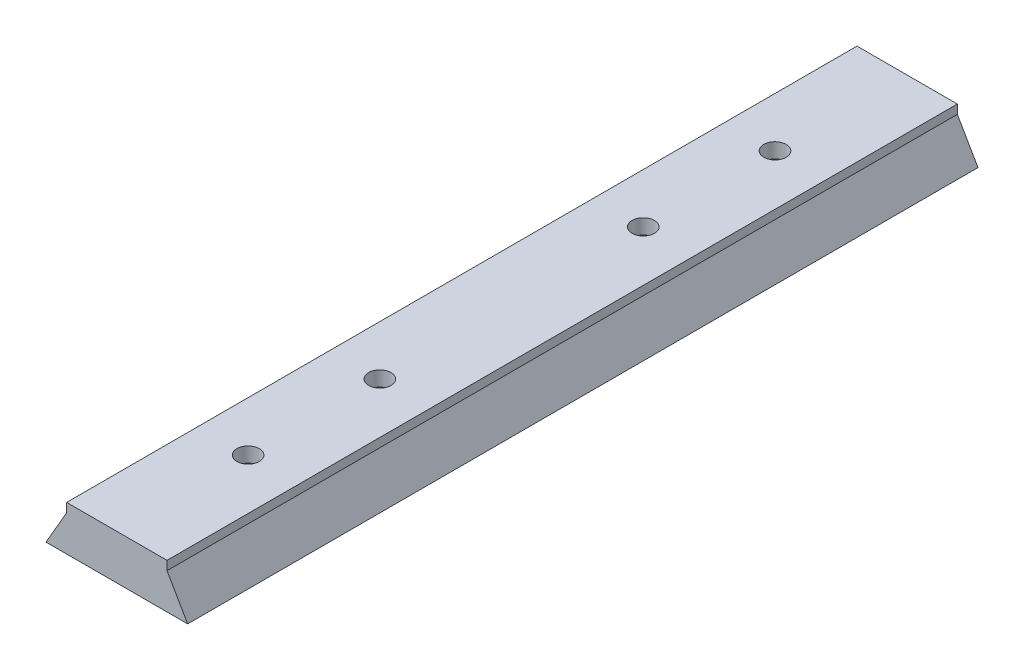
ISO-10303-21;
HEADER;
FILE_DESCRIPTION(('STEP AP214'),'2;1');
FILE_NAME('part.step','',(''),(''),'','','');
FILE_SCHEMA(('AUTOMOTIVE_DESIGN { 1 0 10303 214 1 1 1 1 }'));
ENDSEC;
DATA;
#1=APPLICATION_CONTEXT('core data for automotive mechanical design processes');
#2=APPLICATION_PROTOCOL_DEFINITION('international standard','automotive_design',2000,#1);
#3=PRODUCT_CONTEXT('',#1,'mechanical');
#4=PRODUCT('Part','Part','',(#3));
#5=PRODUCT_RELATED_PRODUCT_CATEGORY('part','',(#4));
#6=PRODUCT_DEFINITION_FORMATION('','',#4);
#7=PRODUCT_DEFINITION_CONTEXT('part definition',#1,'design');
#8=PRODUCT_DEFINITION('design','',#6,#7);
#9=PRODUCT_DEFINITION_SHAPE('','',#8);
#10=(LENGTH_UNIT() NAMED_UNIT(*) SI_UNIT(.MILLI.,.METRE.));
#11=(NAMED_UNIT(*) PLANE_ANGLE_UNIT() SI_UNIT($,.RADIAN.));
#12=(NAMED_UNIT(*) SI_UNIT($,.STERADIAN.) SOLID_ANGLE_UNIT());
#13=UNCERTAINTY_MEASURE_WITH_UNIT(LENGTH_MEASURE(1.E-05),#10,'distance_accuracy_value','');
#14=(GEOMETRIC_REPRESENTATION_CONTEXT(3) GLOBAL_UNCERTAINTY_ASSIGNED_CONTEXT((#13)) GLOBAL_UNIT_ASSIGNED_CONTEXT((#10,
#11,#12)) REPRESENTATION_CONTEXT('',''));
#15=CARTESIAN_POINT('',(0.,0.,0.));
#16=DIRECTION('',(0.,0.,1.));
#17=DIRECTION('',(1.,0.,0.));
#18=AXIS2_PLACEMENT_3D('',#15,#16,#17);
#19=CARTESIAN_POINT('',(170.94,-6.99999999999998,35.3333333333333));
#20=DIRECTION('',(0.,1.,0.));
#21=DIRECTION('',(-1.,0.,0.));
#22=AXIS2_PLACEMENT_3D('',#19,#20,#21);
#23=CYLINDRICAL_SURFACE('',#22,1.5);
#24=CARTESIAN_POINT('',(170.94,0.,35.3333333333333));
#25=DIRECTION('',(0.,-1.,0.));
#26=DIRECTION('',(0.,0.,-1.));
#27=AXIS2_PLACEMENT_3D('',#24,#25,#26);
#28=CIRCLE('',#27,1.5);
#29=CARTESIAN_POINT('',(170.94,0.,33.8333333333333));
#30=VERTEX_POINT('',#29);
#31=EDGE_CURVE('E106',#30,#30,#28,.F.);
#32=ORIENTED_EDGE('',*,*,#31,.T.);
#33=EDGE_LOOP('',(#32));
#34=FACE_BOUND('',#33,.T.);
#35=CARTESIAN_POINT('',(170.94,-1.99999999999999,35.3333333333333));
#36=DIRECTION('',(0.,-1.,0.));
#37=DIRECTION('',(1.,0.,0.));
#38=AXIS2_PLACEMENT_3D('',#35,#36,#37);
#39=CIRCLE('',#38,1.5);
#40=CARTESIAN_POINT('',(172.44,-1.99999999999999,35.3333333333333));
#41=VERTEX_POINT('',#40);
#42=EDGE_CURVE('E157',#41,#41,#39,.F.);
#43=ORIENTED_EDGE('',*,*,#42,.F.);
#44=EDGE_LOOP('',(#43));
#45=FACE_BOUND('',#44,.T.);
#46=ADVANCED_FACE('F35',(#34,#45),#23,.F.);
#47=CARTESIAN_POINT('',(170.94,-6.99999999999998,17.6666666666667));
#48=DIRECTION('',(0.,1.,0.));
#49=DIRECTION('',(-1.,0.,0.));
#50=AXIS2_PLACEMENT_3D('',#47,#48,#49);
#51=CYLINDRICAL_SURFACE('',#50,1.5);
#52=CARTESIAN_POINT('',(170.94,0.,17.6666666666667));
#53=DIRECTION('',(0.,-1.,0.));
#54=DIRECTION('',(0.,0.,-1.));
#55=AXIS2_PLACEMENT_3D('',#52,#53,#54);
#56=CIRCLE('',#55,1.5);
#57=CARTESIAN_POINT('',(170.94,0.,16.1666666666667));
#58=VERTEX_POINT('',#57);
#59=EDGE_CURVE('E150',#58,#58,#56,.F.);
#60=ORIENTED_EDGE('',*,*,#59,.T.);
#61=EDGE_LOOP('',(#60));
#62=FACE_BOUND('',#61,.T.);
#63=CARTESIAN_POINT('',(170.94,-1.99999999999999,17.6666666666667));
#64=DIRECTION('',(0.,-1.,0.));
#65=DIRECTION('',(1.,0.,0.));
#66=AXIS2_PLACEMENT_3D('',#63,#64,#65);
#67=CIRCLE('',#66,1.5);
#68=CARTESIAN_POINT('',(172.44,-1.99999999999999,17.6666666666667));
#69=VERTEX_POINT('',#68);
#70=EDGE_CURVE('E154',#69,#69,#67,.F.);
#71=ORIENTED_EDGE('',*,*,#70,.F.);
#72=EDGE_LOOP('',(#71));
#73=FACE_BOUND('',#72,.T.);
#74=ADVANCED_FACE('F180',(#62,#73),#51,.F.);
#75=CARTESIAN_POINT('',(0.,0.,0.));
#76=DIRECTION('',(0.,-1.,0.));
#77=DIRECTION('',(0.,0.,-1.));
#78=AXIS2_PLACEMENT_3D('',#75,#76,#77);
#79=PLANE('',#78);
#80=ORIENTED_EDGE('',*,*,#31,.F.);
#81=EDGE_LOOP('',(#80));
#82=FACE_BOUND('',#81,.T.);
#83=CARTESIAN_POINT('',(170.94,0.,88.3333333333333));
#84=DIRECTION('',(0.,-1.,0.));
#85=DIRECTION('',(0.,0.,-1.));
#86=AXIS2_PLACEMENT_3D('',#83,#84,#85);
#87=CIRCLE('',#86,1.5);
#88=CARTESIAN_POINT('',(170.94,0.,86.8333333333333));
#89=VERTEX_POINT('',#88);
#90=EDGE_CURVE('E100',#89,#89,#87,.T.);
#91=ORIENTED_EDGE('',*,*,#90,.T.);
#92=EDGE_LOOP('',(#91));
#93=FACE_BOUND('',#92,.T.);
#94=CARTESIAN_POINT('',(170.94,0.,70.6666666666667));
#95=DIRECTION('',(0.,-1.,0.));
#96=DIRECTION('',(0.,0.,-1.));
#97=AXIS2_PLACEMENT_3D('',#94,#95,#96);
#98=CIRCLE('',#97,1.5);
#99=CARTESIAN_POINT('',(170.94,0.,69.1666666666667));
#100=VERTEX_POINT('',#99);
#101=EDGE_CURVE('E44',#100,#100,#98,.T.);
#102=ORIENTED_EDGE('',*,*,#101,.T.);
#103=EDGE_LOOP('',(#102));
#104=FACE_BOUND('',#103,.T.);
#105=ORIENTED_EDGE('',*,*,#59,.F.);
#106=EDGE_LOOP('',(#105));
#107=FACE_BOUND('',#106,.T.);
#108=DIRECTION('',(0.,0.,-1.));
#109=VECTOR('',#108,1.);
#110=CARTESIAN_POINT('',(164.27128129211,0.,106.));
#111=LINE('',#110,#109);
#112=CARTESIAN_POINT('',(164.27128129211,0.,106.));
#113=VERTEX_POINT('',#112);
#114=CARTESIAN_POINT('',(164.27128129211,0.,0.));
#115=VERTEX_POINT('',#114);
#116=EDGE_CURVE('E103',#113,#115,#111,.T.);
#117=ORIENTED_EDGE('',*,*,#116,.F.);
#118=DIRECTION('',(1.,0.,0.));
#119=VECTOR('',#118,1.);
#120=CARTESIAN_POINT('',(0.,0.,106.));
#121=LINE('',#120,#119);
#122=CARTESIAN_POINT('',(177.72871870789,0.,106.));
#123=VERTEX_POINT('',#122);
#124=EDGE_CURVE('E90',#113,#123,#121,.T.);
#125=ORIENTED_EDGE('',*,*,#124,.T.);
#126=DIRECTION('',(0.,0.,-1.));
#127=VECTOR('',#126,1.);
#128=CARTESIAN_POINT('',(177.72871870789,0.,106.));
#129=LINE('',#128,#127);
#130=CARTESIAN_POINT('',(177.72871870789,0.,0.));
#131=VERTEX_POINT('',#130);
#132=EDGE_CURVE('E11',#123,#131,#129,.T.);
#133=ORIENTED_EDGE('',*,*,#132,.T.);
#134=DIRECTION('',(1.,0.,0.));
#135=VECTOR('',#134,1.);
#136=CARTESIAN_POINT('',(0.,0.,0.));
#137=LINE('',#136,#135);
#138=EDGE_CURVE('E52',#115,#131,#137,.T.);
#139=ORIENTED_EDGE('',*,*,#138,.F.);
#140=EDGE_LOOP('',(#117,#125,#133,#139));
#141=FACE_BOUND('',#140,.T.);
#142=ADVANCED_FACE('F37',(#82,#93,#104,#107,#141),#79,.F.);
#143=CARTESIAN_POINT('',(0.,-6.00000000000003,106.));
#144=DIRECTION('',(0.,-1.,0.));
#145=DIRECTION('',(1.,0.,0.));
#146=AXIS2_PLACEMENT_3D('',#143,#144,#145);
#147=PLANE('',#146);
#148=CARTESIAN_POINT('',(170.94,-5.99999999999999,88.3333333333333));
#149=DIRECTION('',(0.,-1.,0.));
#150=DIRECTION('',(-1.,0.,0.));
#151=AXIS2_PLACEMENT_3D('',#148,#149,#150);
#152=CIRCLE('',#151,2.99999999999999);
#153=CARTESIAN_POINT('',(167.94,-5.99999999999999,88.3333333333333));
#154=VERTEX_POINT('',#153);
#155=EDGE_CURVE('E373',#154,#154,#152,.T.);
#156=ORIENTED_EDGE('',*,*,#155,.F.);
#157=EDGE_LOOP('',(#156));
#158=FACE_BOUND('',#157,.T.);
#159=CARTESIAN_POINT('',(170.94,-5.99999999999999,70.6666666666667));
#160=DIRECTION('',(0.,-1.,0.));
#161=DIRECTION('',(-1.,0.,0.));
#162=AXIS2_PLACEMENT_3D('',#159,#160,#161);
#163=CIRCLE('',#162,2.99999999999999);
#164=CARTESIAN_POINT('',(167.94,-5.99999999999999,70.6666666666667));
#165=VERTEX_POINT('',#164);
#166=EDGE_CURVE('E366',#165,#165,#163,.T.);
#167=ORIENTED_EDGE('',*,*,#166,.F.);
#168=EDGE_LOOP('',(#167));
#169=FACE_BOUND('',#168,.T.);
#170=CARTESIAN_POINT('',(170.94,-5.99999999999999,17.6666666666667));
#171=DIRECTION('',(0.,-1.,0.));
#172=DIRECTION('',(1.,0.,0.));
#173=AXIS2_PLACEMENT_3D('',#170,#171,#172);
#174=CIRCLE('',#173,2.99999999999999);
#175=CARTESIAN_POINT('',(173.94,-5.99999999999999,17.6666666666667));
#176=VERTEX_POINT('',#175);
#177=EDGE_CURVE('E370',#176,#176,#174,.T.);
#178=ORIENTED_EDGE('',*,*,#177,.F.);
#179=EDGE_LOOP('',(#178));
#180=FACE_BOUND('',#179,.T.);
#181=CARTESIAN_POINT('',(170.94,-5.99999999999999,35.3333333333333));
#182=DIRECTION('',(0.,-1.,0.));
#183=DIRECTION('',(1.,0.,0.));
#184=AXIS2_PLACEMENT_3D('',#181,#182,#183);
#185=CIRCLE('',#184,2.99999999999999);
#186=CARTESIAN_POINT('',(173.94,-5.99999999999999,35.3333333333333));
#187=VERTEX_POINT('',#186);
#188=EDGE_CURVE('E118',#187,#187,#185,.T.);
#189=ORIENTED_EDGE('',*,*,#188,.F.);
#190=EDGE_LOOP('',(#189));
#191=FACE_BOUND('',#190,.T.);
#192=DIRECTION('',(-1.,0.,0.));
#193=VECTOR('',#192,1.);
#194=CARTESIAN_POINT('',(0.,-6.00000000000003,0.));
#195=LINE('',#194,#193);
#196=CARTESIAN_POINT('',(180.5,-5.99999999999998,0.));
#197=VERTEX_POINT('',#196);
#198=CARTESIAN_POINT('',(161.5,-6.00000000000001,0.));
#199=VERTEX_POINT('',#198);
#200=EDGE_CURVE('E133',#197,#199,#195,.T.);
#201=ORIENTED_EDGE('',*,*,#200,.F.);
#202=DIRECTION('',(0.,0.,-1.));
#203=VECTOR('',#202,1.);
#204=CARTESIAN_POINT('',(180.5,-5.99999999999998,106.));
#205=LINE('',#204,#203);
#206=CARTESIAN_POINT('',(180.5,-5.99999999999998,106.));
#207=VERTEX_POINT('',#206);
#208=EDGE_CURVE('E139',#207,#197,#205,.T.);
#209=ORIENTED_EDGE('',*,*,#208,.F.);
#210=DIRECTION('',(-1.,0.,0.));
#211=VECTOR('',#210,1.);
#212=CARTESIAN_POINT('',(0.,-6.00000000000003,106.));
#213=LINE('',#212,#211);
#214=CARTESIAN_POINT('',(161.5,-6.00000000000001,106.));
#215=VERTEX_POINT('',#214);
#216=EDGE_CURVE('E113',#207,#215,#213,.T.);
#217=ORIENTED_EDGE('',*,*,#216,.T.);
#218=DIRECTION('',(0.,0.,-1.));
#219=VECTOR('',#218,1.);
#220=CARTESIAN_POINT('',(161.5,-6.00000000000001,106.));
#221=LINE('',#220,#219);
#222=EDGE_CURVE('E141',#215,#199,#221,.T.);
#223=ORIENTED_EDGE('',*,*,#222,.T.);
#224=EDGE_LOOP('',(#201,#209,#217,#223));
#225=FACE_BOUND('',#224,.T.);
#226=ADVANCED_FACE('F174',(#158,#169,#180,#191,#225),#147,.T.);
#227=CARTESIAN_POINT('',(170.94,-6.99999999999998,70.6666666666667));
#228=DIRECTION('',(0.,1.,0.));
#229=DIRECTION('',(-1.,0.,0.));
#230=AXIS2_PLACEMENT_3D('',#227,#228,#229);
#231=CYLINDRICAL_SURFACE('',#230,1.5);
#232=CARTESIAN_POINT('',(170.94,-1.99999999999999,70.6666666666667));
#233=DIRECTION('',(0.,1.,0.));
#234=DIRECTION('',(-1.,0.,0.));
#235=AXIS2_PLACEMENT_3D('',#232,#233,#234);
#236=CIRCLE('',#235,1.5);
#237=CARTESIAN_POINT('',(169.44,-1.99999999999999,70.6666666666667));
#238=VERTEX_POINT('',#237);
#239=EDGE_CURVE('E39',#238,#238,#236,.T.);
#240=ORIENTED_EDGE('',*,*,#239,.F.);
#241=EDGE_LOOP('',(#240));
#242=FACE_BOUND('',#241,.T.);
#243=ORIENTED_EDGE('',*,*,#101,.F.);
#244=EDGE_LOOP('',(#243));
#245=FACE_BOUND('',#244,.T.);
#246=ADVANCED_FACE('F170',(#242,#245),#231,.F.);
#247=CARTESIAN_POINT('',(170.94,-6.99999999999998,88.3333333333333));
#248=DIRECTION('',(0.,1.,0.));
#249=DIRECTION('',(-1.,0.,0.));
#250=AXIS2_PLACEMENT_3D('',#247,#248,#249);
#251=CYLINDRICAL_SURFACE('',#250,1.5);
#252=CARTESIAN_POINT('',(170.94,-1.99999999999999,88.3333333333333));
#253=DIRECTION('',(0.,1.,0.));
#254=DIRECTION('',(-1.,0.,0.));
#255=AXIS2_PLACEMENT_3D('',#252,#253,#254);
#256=CIRCLE('',#255,1.5);
#257=CARTESIAN_POINT('',(169.44,-1.99999999999999,88.3333333333333));
#258=VERTEX_POINT('',#257);
#259=EDGE_CURVE('E160',#258,#258,#256,.T.);
#260=ORIENTED_EDGE('',*,*,#259,.F.);
#261=EDGE_LOOP('',(#260));
#262=FACE_BOUND('',#261,.T.);
#263=ORIENTED_EDGE('',*,*,#90,.F.);
#264=EDGE_LOOP('',(#263));
#265=FACE_BOUND('',#264,.T.);
#266=ADVANCED_FACE('F173',(#262,#265),#251,.F.);
#267=CARTESIAN_POINT('',(123.723076211353,-71.4315513555935,106.));
#268=DIRECTION('',(-0.866025403784438,0.500000000000001,0.));
#269=DIRECTION('',(-0.500000000000001,-0.866025403784438,0.));
#270=AXIS2_PLACEMENT_3D('',#267,#268,#269);
#271=PLANE('',#270);
#272=DIRECTION('',(0.500000000000001,0.866025403784438,0.));
#273=VECTOR('',#272,1.);
#274=CARTESIAN_POINT('',(123.723076211353,-71.4315513555935,0.));
#275=LINE('',#274,#273);
#276=CARTESIAN_POINT('',(164.27128129211,-1.19999999999999,0.));
#277=VERTEX_POINT('',#276);
#278=EDGE_CURVE('E130',#199,#277,#275,.T.);
#279=ORIENTED_EDGE('',*,*,#278,.F.);
#280=ORIENTED_EDGE('',*,*,#222,.F.);
#281=DIRECTION('',(0.500000000000001,0.866025403784438,0.));
#282=VECTOR('',#281,1.);
#283=CARTESIAN_POINT('',(123.723076211353,-71.4315513555935,106.));
#284=LINE('',#283,#282);
#285=CARTESIAN_POINT('',(164.27128129211,-1.19999999999999,106.));
#286=VERTEX_POINT('',#285);
#287=EDGE_CURVE('E110',#215,#286,#284,.T.);
#288=ORIENTED_EDGE('',*,*,#287,.T.);
#289=DIRECTION('',(0.,0.,-1.));
#290=VECTOR('',#289,1.);
#291=CARTESIAN_POINT('',(164.27128129211,-1.19999999999999,106.));
#292=LINE('',#291,#290);
#293=EDGE_CURVE('E107',#286,#277,#292,.T.);
#294=ORIENTED_EDGE('',*,*,#293,.T.);
#295=EDGE_LOOP('',(#279,#280,#288,#294));
#296=FACE_BOUND('',#295,.T.);
#297=ADVANCED_FACE('F215',(#296),#271,.T.);
#298=CARTESIAN_POINT('',(132.776923788647,76.6587926915457,106.));
#299=DIRECTION('',(0.866025403784438,0.500000000000001,0.));
#300=DIRECTION('',(-0.500000000000001,0.866025403784438,0.));
#301=AXIS2_PLACEMENT_3D('',#298,#299,#300);
#302=PLANE('',#301);
#303=DIRECTION('',(0.500000000000001,-0.866025403784438,0.));
#304=VECTOR('',#303,1.);
#305=CARTESIAN_POINT('',(132.776923788647,76.6587926915457,0.));
#306=LINE('',#305,#304);
#307=CARTESIAN_POINT('',(177.72871870789,-1.19999999999998,0.));
#308=VERTEX_POINT('',#307);
#309=EDGE_CURVE('E115',#308,#197,#306,.T.);
#310=ORIENTED_EDGE('',*,*,#309,.F.);
#311=DIRECTION('',(0.,0.,-1.));
#312=VECTOR('',#311,1.);
#313=CARTESIAN_POINT('',(177.72871870789,-1.19999999999998,106.));
#314=LINE('',#313,#312);
#315=CARTESIAN_POINT('',(177.72871870789,-1.19999999999998,106.));
#316=VERTEX_POINT('',#315);
#317=EDGE_CURVE('E127',#316,#308,#314,.T.);
#318=ORIENTED_EDGE('',*,*,#317,.F.);
#319=DIRECTION('',(0.500000000000001,-0.866025403784438,0.));
#320=VECTOR('',#319,1.);
#321=CARTESIAN_POINT('',(132.776923788647,76.6587926915457,106.));
#322=LINE('',#321,#320);
#323=EDGE_CURVE('E123',#316,#207,#322,.T.);
#324=ORIENTED_EDGE('',*,*,#323,.T.);
#325=ORIENTED_EDGE('',*,*,#208,.T.);
#326=EDGE_LOOP('',(#310,#318,#324,#325));
#327=FACE_BOUND('',#326,.T.);
#328=ADVANCED_FACE('F221',(#327),#302,.T.);
#329=CARTESIAN_POINT('',(0.,0.,106.));
#330=DIRECTION('',(0.,0.,1.));
#331=DIRECTION('',(1.,0.,0.));
#332=AXIS2_PLACEMENT_3D('',#329,#330,#331);
#333=PLANE('',#332);
#334=ORIENTED_EDGE('',*,*,#124,.F.);
#335=DIRECTION('',(0.,1.,0.));
#336=VECTOR('',#335,1.);
#337=CARTESIAN_POINT('',(164.27128129211,-7.59907328229902E-12,106.));
#338=LINE('',#337,#336);
#339=EDGE_CURVE('E95',#286,#113,#338,.T.);
#340=ORIENTED_EDGE('',*,*,#339,.F.);
#341=ORIENTED_EDGE('',*,*,#287,.F.);
#342=ORIENTED_EDGE('',*,*,#216,.F.);
#343=ORIENTED_EDGE('',*,*,#323,.F.);
#344=DIRECTION('',(0.,-1.,0.));
#345=VECTOR('',#344,1.);
#346=CARTESIAN_POINT('',(177.72871870789,0.,106.));
#347=LINE('',#346,#345);
#348=EDGE_CURVE('E98',#123,#316,#347,.T.);
#349=ORIENTED_EDGE('',*,*,#348,.F.);
#350=EDGE_LOOP('',(#334,#340,#341,#342,#343,#349));
#351=FACE_BOUND('',#350,.T.);
#352=ADVANCED_FACE('F92',(#351),#333,.T.);
#353=CARTESIAN_POINT('',(0.,0.,0.));
#354=DIRECTION('',(0.,0.,1.));
#355=DIRECTION('',(1.,0.,0.));
#356=AXIS2_PLACEMENT_3D('',#353,#354,#355);
#357=PLANE('',#356);
#358=DIRECTION('',(0.,1.,0.));
#359=VECTOR('',#358,1.);
#360=CARTESIAN_POINT('',(164.27128129211,-7.59907328229902E-12,0.));
#361=LINE('',#360,#359);
#362=EDGE_CURVE('E128',#277,#115,#361,.T.);
#363=ORIENTED_EDGE('',*,*,#362,.T.);
#364=ORIENTED_EDGE('',*,*,#138,.T.);
#365=DIRECTION('',(0.,-1.,0.));
#366=VECTOR('',#365,1.);
#367=CARTESIAN_POINT('',(177.72871870789,0.,0.));
#368=LINE('',#367,#366);
#369=EDGE_CURVE('E111',#131,#308,#368,.T.);
#370=ORIENTED_EDGE('',*,*,#369,.T.);
#371=ORIENTED_EDGE('',*,*,#309,.T.);
#372=ORIENTED_EDGE('',*,*,#200,.T.);
#373=ORIENTED_EDGE('',*,*,#278,.T.);
#374=EDGE_LOOP('',(#363,#364,#370,#371,#372,#373));
#375=FACE_BOUND('',#374,.T.);
#376=ADVANCED_FACE('F220',(#375),#357,.F.);
#377=CARTESIAN_POINT('',(177.72871870789,0.,106.));
#378=DIRECTION('',(1.,0.,0.));
#379=DIRECTION('',(0.,0.,-1.));
#380=AXIS2_PLACEMENT_3D('',#377,#378,#379);
#381=PLANE('',#380);
#382=ORIENTED_EDGE('',*,*,#369,.F.);
#383=ORIENTED_EDGE('',*,*,#132,.F.);
#384=ORIENTED_EDGE('',*,*,#348,.T.);
#385=ORIENTED_EDGE('',*,*,#317,.T.);
#386=EDGE_LOOP('',(#382,#383,#384,#385));
#387=FACE_BOUND('',#386,.T.);
#388=ADVANCED_FACE('F201',(#387),#381,.T.);
#389=CARTESIAN_POINT('',(164.27128129211,-7.59907328229902E-12,106.));
#390=DIRECTION('',(-1.,0.,0.));
#391=DIRECTION('',(0.,-1.,0.));
#392=AXIS2_PLACEMENT_3D('',#389,#390,#391);
#393=PLANE('',#392);
#394=ORIENTED_EDGE('',*,*,#362,.F.);
#395=ORIENTED_EDGE('',*,*,#293,.F.);
#396=ORIENTED_EDGE('',*,*,#339,.T.);
#397=ORIENTED_EDGE('',*,*,#116,.T.);
#398=EDGE_LOOP('',(#394,#395,#396,#397));
#399=FACE_BOUND('',#398,.T.);
#400=ADVANCED_FACE('F109',(#399),#393,.T.);
#401=CARTESIAN_POINT('',(170.94,-1.99999999999999,17.6666666666667));
#402=DIRECTION('',(0.,-1.,0.));
#403=DIRECTION('',(1.,0.,0.));
#404=AXIS2_PLACEMENT_3D('',#401,#402,#403);
#405=PLANE('',#404);
#406=CARTESIAN_POINT('',(170.94,-1.99999999999999,17.6666666666667));
#407=DIRECTION('',(0.,-1.,0.));
#408=DIRECTION('',(1.,0.,0.));
#409=AXIS2_PLACEMENT_3D('',#406,#407,#408);
#410=CIRCLE('',#409,2.99999999999999);
#411=CARTESIAN_POINT('',(173.94,-1.99999999999999,17.6666666666667));
#412=VERTEX_POINT('',#411);
#413=EDGE_CURVE('E381',#412,#412,#410,.T.);
#414=ORIENTED_EDGE('',*,*,#413,.T.);
#415=EDGE_LOOP('',(#414));
#416=FACE_BOUND('',#415,.T.);
#417=ORIENTED_EDGE('',*,*,#70,.T.);
#418=EDGE_LOOP('',(#417));
#419=FACE_BOUND('',#418,.T.);
#420=ADVANCED_FACE('F189',(#416,#419),#405,.T.);
#421=CARTESIAN_POINT('',(170.94,-1.99999999999999,17.6666666666667));
#422=DIRECTION('',(0.,-1.,0.));
#423=DIRECTION('',(1.,0.,0.));
#424=AXIS2_PLACEMENT_3D('',#421,#422,#423);
#425=CYLINDRICAL_SURFACE('',#424,2.99999999999999);
#426=ORIENTED_EDGE('',*,*,#413,.F.);
#427=EDGE_LOOP('',(#426));
#428=FACE_BOUND('',#427,.T.);
#429=ORIENTED_EDGE('',*,*,#177,.T.);
#430=EDGE_LOOP('',(#429));
#431=FACE_BOUND('',#430,.T.);
#432=ADVANCED_FACE('F191',(#428,#431),#425,.F.);
#433=CARTESIAN_POINT('',(170.94,-1.99999999999999,35.3333333333333));
#434=DIRECTION('',(0.,-1.,0.));
#435=DIRECTION('',(1.,0.,0.));
#436=AXIS2_PLACEMENT_3D('',#433,#434,#435);
#437=PLANE('',#436);
#438=CARTESIAN_POINT('',(170.94,-1.99999999999999,35.3333333333333));
#439=DIRECTION('',(0.,-1.,0.));
#440=DIRECTION('',(1.,0.,0.));
#441=AXIS2_PLACEMENT_3D('',#438,#439,#440);
#442=CIRCLE('',#441,2.99999999999999);
#443=CARTESIAN_POINT('',(173.94,-1.99999999999999,35.3333333333333));
#444=VERTEX_POINT('',#443);
#445=EDGE_CURVE('E158',#444,#444,#442,.T.);
#446=ORIENTED_EDGE('',*,*,#445,.T.);
#447=EDGE_LOOP('',(#446));
#448=FACE_BOUND('',#447,.T.);
#449=ORIENTED_EDGE('',*,*,#42,.T.);
#450=EDGE_LOOP('',(#449));
#451=FACE_BOUND('',#450,.T.);
#452=ADVANCED_FACE('F198',(#448,#451),#437,.T.);
#453=CARTESIAN_POINT('',(170.94,-1.99999999999999,35.3333333333333));
#454=DIRECTION('',(0.,-1.,0.));
#455=DIRECTION('',(1.,0.,0.));
#456=AXIS2_PLACEMENT_3D('',#453,#454,#455);
#457=CYLINDRICAL_SURFACE('',#456,2.99999999999999);
#458=ORIENTED_EDGE('',*,*,#445,.F.);
#459=EDGE_LOOP('',(#458));
#460=FACE_BOUND('',#459,.T.);
#461=ORIENTED_EDGE('',*,*,#188,.T.);
#462=EDGE_LOOP('',(#461));
#463=FACE_BOUND('',#462,.T.);
#464=ADVANCED_FACE('F310',(#460,#463),#457,.F.);
#465=CARTESIAN_POINT('',(170.94,-1.99999999999999,88.3333333333333));
#466=DIRECTION('',(0.,-1.,0.));
#467=DIRECTION('',(1.,0.,0.));
#468=AXIS2_PLACEMENT_3D('',#465,#466,#467);
#469=CYLINDRICAL_SURFACE('',#468,2.99999999999999);
#470=CARTESIAN_POINT('',(170.94,-1.99999999999999,88.3333333333333));
#471=DIRECTION('',(0.,-1.,0.));
#472=DIRECTION('',(-1.,0.,0.));
#473=AXIS2_PLACEMENT_3D('',#470,#471,#472);
#474=CIRCLE('',#473,2.99999999999999);
#475=CARTESIAN_POINT('',(167.94,-1.99999999999999,88.3333333333333));
#476=VERTEX_POINT('',#475);
#477=EDGE_CURVE('E368',#476,#476,#474,.T.);
#478=ORIENTED_EDGE('',*,*,#477,.F.);
#479=EDGE_LOOP('',(#478));
#480=FACE_BOUND('',#479,.T.);
#481=ORIENTED_EDGE('',*,*,#155,.T.);
#482=EDGE_LOOP('',(#481));
#483=FACE_BOUND('',#482,.T.);
#484=ADVANCED_FACE('F320',(#480,#483),#469,.F.);
#485=CARTESIAN_POINT('',(170.94,-1.99999999999999,88.3333333333333));
#486=DIRECTION('',(0.,1.,0.));
#487=DIRECTION('',(-1.,0.,0.));
#488=AXIS2_PLACEMENT_3D('',#485,#486,#487);
#489=PLANE('',#488);
#490=ORIENTED_EDGE('',*,*,#259,.T.);
#491=EDGE_LOOP('',(#490));
#492=FACE_BOUND('',#491,.T.);
#493=ORIENTED_EDGE('',*,*,#477,.T.);
#494=EDGE_LOOP('',(#493));
#495=FACE_BOUND('',#494,.T.);
#496=ADVANCED_FACE('F329',(#492,#495),#489,.F.);
#497=CARTESIAN_POINT('',(170.94,-1.99999999999999,70.6666666666667));
#498=DIRECTION('',(0.,-1.,0.));
#499=DIRECTION('',(1.,0.,0.));
#500=AXIS2_PLACEMENT_3D('',#497,#498,#499);
#501=CYLINDRICAL_SURFACE('',#500,2.99999999999999);
#502=CARTESIAN_POINT('',(170.94,-1.99999999999999,70.6666666666667));
#503=DIRECTION('',(0.,-1.,0.));
#504=DIRECTION('',(-1.,0.,0.));
#505=AXIS2_PLACEMENT_3D('',#502,#503,#504);
#506=CIRCLE('',#505,2.99999999999999);
#507=CARTESIAN_POINT('',(167.94,-1.99999999999999,70.6666666666667));
#508=VERTEX_POINT('',#507);
#509=EDGE_CURVE('E363',#508,#508,#506,.T.);
#510=ORIENTED_EDGE('',*,*,#509,.F.);
#511=EDGE_LOOP('',(#510));
#512=FACE_BOUND('',#511,.T.);
#513=ORIENTED_EDGE('',*,*,#166,.T.);
#514=EDGE_LOOP('',(#513));
#515=FACE_BOUND('',#514,.T.);
#516=ADVANCED_FACE('F339',(#512,#515),#501,.F.);
#517=CARTESIAN_POINT('',(170.94,-1.99999999999999,70.6666666666667));
#518=DIRECTION('',(0.,1.,0.));
#519=DIRECTION('',(-1.,0.,0.));
#520=AXIS2_PLACEMENT_3D('',#517,#518,#519);
#521=PLANE('',#520);
#522=ORIENTED_EDGE('',*,*,#239,.T.);
#523=EDGE_LOOP('',(#522));
#524=FACE_BOUND('',#523,.T.);
#525=ORIENTED_EDGE('',*,*,#509,.T.);
#526=EDGE_LOOP('',(#525));
#527=FACE_BOUND('',#526,.T.);
#528=ADVANCED_FACE('F167',(#524,#527),#521,.F.);
#529=CLOSED_SHELL('',(#46,#74,#142,#226,#246,#266,#297,#328,#352,#376,#388,#400,#420,#432,#452,
#464,#484,#496,#516,#528));
#530=MANIFOLD_SOLID_BREP('B2',#529);
#531=ADVANCED_BREP_SHAPE_REPRESENTATION('',(#18,#530),#14);
#532=SHAPE_DEFINITION_REPRESENTATION(#9,#531);
ENDSEC;
END-ISO-10303-21;
